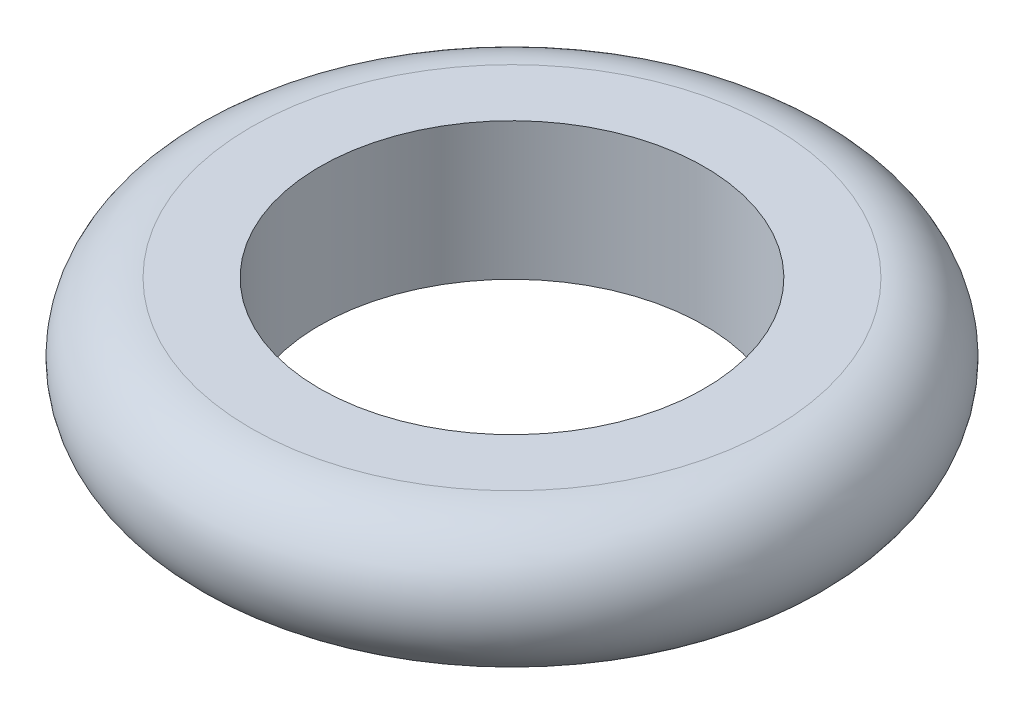
ISO-10303-21;
HEADER;
FILE_DESCRIPTION(('STEP AP214'),'2;1');
FILE_NAME('part.step','',(''),(''),'','','');
FILE_SCHEMA(('AUTOMOTIVE_DESIGN { 1 0 10303 214 1 1 1 1 }'));
ENDSEC;
DATA;
#1=APPLICATION_CONTEXT('core data for automotive mechanical design processes');
#2=APPLICATION_PROTOCOL_DEFINITION('international standard','automotive_design',2000,#1);
#3=PRODUCT_CONTEXT('',#1,'mechanical');
#4=PRODUCT('Part','Part','',(#3));
#5=PRODUCT_RELATED_PRODUCT_CATEGORY('part','',(#4));
#6=PRODUCT_DEFINITION_FORMATION('','',#4);
#7=PRODUCT_DEFINITION_CONTEXT('part definition',#1,'design');
#8=PRODUCT_DEFINITION('design','',#6,#7);
#9=PRODUCT_DEFINITION_SHAPE('','',#8);
#10=(LENGTH_UNIT() NAMED_UNIT(*) SI_UNIT(.MILLI.,.METRE.));
#11=(NAMED_UNIT(*) PLANE_ANGLE_UNIT() SI_UNIT($,.RADIAN.));
#12=(NAMED_UNIT(*) SI_UNIT($,.STERADIAN.) SOLID_ANGLE_UNIT());
#13=UNCERTAINTY_MEASURE_WITH_UNIT(LENGTH_MEASURE(1.E-05),#10,'distance_accuracy_value','');
#14=(GEOMETRIC_REPRESENTATION_CONTEXT(3) GLOBAL_UNCERTAINTY_ASSIGNED_CONTEXT((#13)) GLOBAL_UNIT_ASSIGNED_CONTEXT((#10,
#11,#12)) REPRESENTATION_CONTEXT('',''));
#15=CARTESIAN_POINT('',(0.,0.,0.));
#16=DIRECTION('',(0.,0.,1.));
#17=DIRECTION('',(1.,0.,0.));
#18=AXIS2_PLACEMENT_3D('',#15,#16,#17);
#19=CARTESIAN_POINT('',(0.,25.,0.));
#20=DIRECTION('',(0.,1.,0.));
#21=DIRECTION('',(0.,0.,1.));
#22=AXIS2_PLACEMENT_3D('',#19,#20,#21);
#23=TOROIDAL_SURFACE('',#22,95.,25.);
#24=CARTESIAN_POINT('',(0.,0.,0.));
#25=DIRECTION('',(0.,1.,0.));
#26=DIRECTION('',(0.,0.,1.));
#27=AXIS2_PLACEMENT_3D('',#24,#25,#26);
#28=CIRCLE('',#27,95.);
#29=CARTESIAN_POINT('',(0.,0.,95.));
#30=VERTEX_POINT('',#29);
#31=EDGE_CURVE('E43',#30,#30,#28,.F.);
#32=ORIENTED_EDGE('',*,*,#31,.F.);
#33=EDGE_LOOP('',(#32));
#34=FACE_BOUND('',#33,.T.);
#35=CARTESIAN_POINT('',(0.,50.,0.));
#36=DIRECTION('',(0.,1.,0.));
#37=DIRECTION('',(0.,0.,1.));
#38=AXIS2_PLACEMENT_3D('',#35,#36,#37);
#39=CIRCLE('',#38,95.);
#40=CARTESIAN_POINT('',(0.,50.,95.));
#41=VERTEX_POINT('',#40);
#42=EDGE_CURVE('E10',#41,#41,#39,.T.);
#43=ORIENTED_EDGE('',*,*,#42,.F.);
#44=EDGE_LOOP('',(#43));
#45=FACE_BOUND('',#44,.T.);
#46=ADVANCED_FACE('F36',(#34,#45),#23,.T.);
#47=CARTESIAN_POINT('',(0.,50.,0.));
#48=DIRECTION('',(0.,1.,0.));
#49=DIRECTION('',(0.,0.,1.));
#50=AXIS2_PLACEMENT_3D('',#47,#48,#49);
#51=PLANE('',#50);
#52=ORIENTED_EDGE('',*,*,#42,.T.);
#53=EDGE_LOOP('',(#52));
#54=FACE_BOUND('',#53,.T.);
#55=CARTESIAN_POINT('',(0.,50.,0.));
#56=DIRECTION('',(0.,1.,0.));
#57=DIRECTION('',(0.,0.,1.));
#58=AXIS2_PLACEMENT_3D('',#55,#56,#57);
#59=CIRCLE('',#58,70.);
#60=CARTESIAN_POINT('',(0.,50.,70.));
#61=VERTEX_POINT('',#60);
#62=EDGE_CURVE('E47',#61,#61,#59,.T.);
#63=ORIENTED_EDGE('',*,*,#62,.F.);
#64=EDGE_LOOP('',(#63));
#65=FACE_BOUND('',#64,.T.);
#66=ADVANCED_FACE('F66',(#54,#65),#51,.T.);
#67=CARTESIAN_POINT('',(0.,0.,0.));
#68=DIRECTION('',(0.,1.,0.));
#69=DIRECTION('',(0.,0.,1.));
#70=AXIS2_PLACEMENT_3D('',#67,#68,#69);
#71=PLANE('',#70);
#72=ORIENTED_EDGE('',*,*,#31,.T.);
#73=EDGE_LOOP('',(#72));
#74=FACE_BOUND('',#73,.T.);
#75=CARTESIAN_POINT('',(0.,0.,0.));
#76=DIRECTION('',(0.,1.,0.));
#77=DIRECTION('',(0.,0.,1.));
#78=AXIS2_PLACEMENT_3D('',#75,#76,#77);
#79=CIRCLE('',#78,70.);
#80=CARTESIAN_POINT('',(0.,0.,70.));
#81=VERTEX_POINT('',#80);
#82=EDGE_CURVE('E51',#81,#81,#79,.T.);
#83=ORIENTED_EDGE('',*,*,#82,.T.);
#84=EDGE_LOOP('',(#83));
#85=FACE_BOUND('',#84,.T.);
#86=ADVANCED_FACE('F57',(#74,#85),#71,.F.);
#87=CARTESIAN_POINT('',(0.,50.,0.));
#88=DIRECTION('',(0.,-1.,0.));
#89=DIRECTION('',(0.,0.,-1.));
#90=AXIS2_PLACEMENT_3D('',#87,#88,#89);
#91=CYLINDRICAL_SURFACE('',#90,70.);
#92=ORIENTED_EDGE('',*,*,#62,.T.);
#93=EDGE_LOOP('',(#92));
#94=FACE_BOUND('',#93,.T.);
#95=ORIENTED_EDGE('',*,*,#82,.F.);
#96=EDGE_LOOP('',(#95));
#97=FACE_BOUND('',#96,.T.);
#98=ADVANCED_FACE('F59',(#94,#97),#91,.F.);
#99=CLOSED_SHELL('',(#46,#66,#86,#98));
#100=MANIFOLD_SOLID_BREP('B2',#99);
#101=ADVANCED_BREP_SHAPE_REPRESENTATION('',(#18,#100),#14);
#102=SHAPE_DEFINITION_REPRESENTATION(#9,#101);
ENDSEC;
END-ISO-10303-21;
